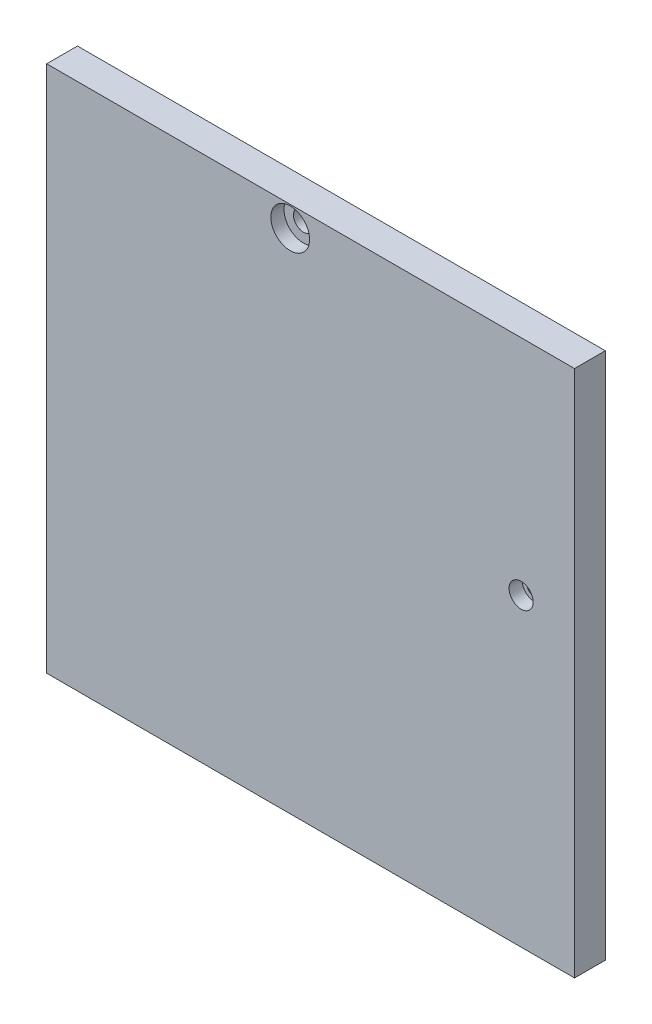
ISO-10303-21;
HEADER;
FILE_DESCRIPTION(('STEP AP214'),'2;1');
FILE_NAME('part.step','',(''),(''),'','','');
FILE_SCHEMA(('AUTOMOTIVE_DESIGN { 1 0 10303 214 1 1 1 1 }'));
ENDSEC;
DATA;
#1=APPLICATION_CONTEXT('core data for automotive mechanical design processes');
#2=APPLICATION_PROTOCOL_DEFINITION('international standard','automotive_design',2000,#1);
#3=PRODUCT_CONTEXT('',#1,'mechanical');
#4=PRODUCT('Part','Part','',(#3));
#5=PRODUCT_RELATED_PRODUCT_CATEGORY('part','',(#4));
#6=PRODUCT_DEFINITION_FORMATION('','',#4);
#7=PRODUCT_DEFINITION_CONTEXT('part definition',#1,'design');
#8=PRODUCT_DEFINITION('design','',#6,#7);
#9=PRODUCT_DEFINITION_SHAPE('','',#8);
#10=(LENGTH_UNIT() NAMED_UNIT(*) SI_UNIT(.MILLI.,.METRE.));
#11=(NAMED_UNIT(*) PLANE_ANGLE_UNIT() SI_UNIT($,.RADIAN.));
#12=(NAMED_UNIT(*) SI_UNIT($,.STERADIAN.) SOLID_ANGLE_UNIT());
#13=UNCERTAINTY_MEASURE_WITH_UNIT(LENGTH_MEASURE(1.E-05),#10,'distance_accuracy_value','');
#14=(GEOMETRIC_REPRESENTATION_CONTEXT(3) GLOBAL_UNCERTAINTY_ASSIGNED_CONTEXT((#13)) GLOBAL_UNIT_ASSIGNED_CONTEXT((#10,
#11,#12)) REPRESENTATION_CONTEXT('',''));
#15=CARTESIAN_POINT('',(0.,0.,0.));
#16=DIRECTION('',(0.,0.,1.));
#17=DIRECTION('',(1.,0.,0.));
#18=AXIS2_PLACEMENT_3D('',#15,#16,#17);
#19=CARTESIAN_POINT('',(52.5,26.7103135608783,0.));
#20=DIRECTION('',(0.,0.,1.));
#21=DIRECTION('',(1.,0.,0.));
#22=AXIS2_PLACEMENT_3D('',#19,#20,#21);
#23=CYLINDRICAL_SURFACE('',#22,1.75584469679078);
#24=CARTESIAN_POINT('',(52.5,26.7103135608783,0.));
#25=DIRECTION('',(0.,0.,1.));
#26=DIRECTION('',(1.,0.,0.));
#27=AXIS2_PLACEMENT_3D('',#24,#25,#26);
#28=CIRCLE('',#27,1.75584469679078);
#29=CARTESIAN_POINT('',(54.2558446967908,26.7103135608783,0.));
#30=VERTEX_POINT('',#29);
#31=EDGE_CURVE('E127',#30,#30,#28,.T.);
#32=ORIENTED_EDGE('',*,*,#31,.F.);
#33=EDGE_LOOP('',(#32));
#34=FACE_BOUND('',#33,.T.);
#35=CARTESIAN_POINT('',(52.5,26.7103135608783,4.));
#36=DIRECTION('',(0.,0.,1.));
#37=DIRECTION('',(1.,0.,0.));
#38=AXIS2_PLACEMENT_3D('',#35,#36,#37);
#39=CIRCLE('',#38,1.75584469679078);
#40=CARTESIAN_POINT('',(54.2558446967908,26.7103135608783,4.));
#41=VERTEX_POINT('',#40);
#42=EDGE_CURVE('E43',#41,#41,#39,.F.);
#43=ORIENTED_EDGE('',*,*,#42,.F.);
#44=EDGE_LOOP('',(#43));
#45=FACE_BOUND('',#44,.T.);
#46=ADVANCED_FACE('F39',(#34,#45),#23,.F.);
#47=CARTESIAN_POINT('',(0.,72.7103135608783,0.));
#48=DIRECTION('',(0.,0.,1.));
#49=DIRECTION('',(1.,0.,0.));
#50=AXIS2_PLACEMENT_3D('',#47,#48,#49);
#51=CYLINDRICAL_SURFACE('',#50,2.26170960327257);
#52=CARTESIAN_POINT('',(0.,72.7103135608783,0.));
#53=DIRECTION('',(0.,0.,1.));
#54=DIRECTION('',(1.,0.,0.));
#55=AXIS2_PLACEMENT_3D('',#52,#53,#54);
#56=CIRCLE('',#55,2.26170960327257);
#57=CARTESIAN_POINT('',(2.26170960327257,72.7103135608783,0.));
#58=VERTEX_POINT('',#57);
#59=EDGE_CURVE('E109',#58,#58,#56,.T.);
#60=ORIENTED_EDGE('',*,*,#59,.F.);
#61=EDGE_LOOP('',(#60));
#62=FACE_BOUND('',#61,.T.);
#63=CARTESIAN_POINT('',(0.,72.7103135608783,4.));
#64=DIRECTION('',(0.,0.,1.));
#65=DIRECTION('',(1.,0.,0.));
#66=AXIS2_PLACEMENT_3D('',#63,#64,#65);
#67=CIRCLE('',#66,2.26170960327257);
#68=CARTESIAN_POINT('',(2.26170960327257,72.7103135608783,4.));
#69=VERTEX_POINT('',#68);
#70=EDGE_CURVE('E114',#69,#69,#67,.F.);
#71=ORIENTED_EDGE('',*,*,#70,.F.);
#72=EDGE_LOOP('',(#71));
#73=FACE_BOUND('',#72,.T.);
#74=ADVANCED_FACE('F145',(#62,#73),#51,.F.);
#75=CARTESIAN_POINT('',(-55.3615679526822,77.4232224220167,7.));
#76=DIRECTION('',(1.,0.,0.));
#77=DIRECTION('',(0.,1.,0.));
#78=AXIS2_PLACEMENT_3D('',#75,#76,#77);
#79=PLANE('',#78);
#80=DIRECTION('',(0.,-1.,0.));
#81=VECTOR('',#80,1.);
#82=CARTESIAN_POINT('',(-55.3615679526822,77.4232224220167,0.));
#83=LINE('',#82,#81);
#84=CARTESIAN_POINT('',(-55.3615679526822,77.4232224220167,0.));
#85=VERTEX_POINT('',#84);
#86=CARTESIAN_POINT('',(-55.3615679526822,-42.5767775779833,0.));
#87=VERTEX_POINT('',#86);
#88=EDGE_CURVE('E106',#85,#87,#83,.T.);
#89=ORIENTED_EDGE('',*,*,#88,.T.);
#90=DIRECTION('',(0.,0.,-1.));
#91=VECTOR('',#90,1.);
#92=CARTESIAN_POINT('',(-55.3615679526822,-42.5767775779833,7.));
#93=LINE('',#92,#91);
#94=CARTESIAN_POINT('',(-55.3615679526822,-42.5767775779833,7.));
#95=VERTEX_POINT('',#94);
#96=EDGE_CURVE('E11',#95,#87,#93,.T.);
#97=ORIENTED_EDGE('',*,*,#96,.F.);
#98=DIRECTION('',(0.,-1.,0.));
#99=VECTOR('',#98,1.);
#100=CARTESIAN_POINT('',(-55.3615679526822,77.4232224220167,7.));
#101=LINE('',#100,#99);
#102=CARTESIAN_POINT('',(-55.3615679526822,77.4232224220167,7.));
#103=VERTEX_POINT('',#102);
#104=EDGE_CURVE('E93',#103,#95,#101,.T.);
#105=ORIENTED_EDGE('',*,*,#104,.F.);
#106=DIRECTION('',(0.,0.,-1.));
#107=VECTOR('',#106,1.);
#108=CARTESIAN_POINT('',(-55.3615679526822,77.4232224220167,7.));
#109=LINE('',#108,#107);
#110=EDGE_CURVE('E102',#103,#85,#109,.T.);
#111=ORIENTED_EDGE('',*,*,#110,.T.);
#112=EDGE_LOOP('',(#89,#97,#105,#111));
#113=FACE_BOUND('',#112,.T.);
#114=ADVANCED_FACE('F41',(#113),#79,.F.);
#115=CARTESIAN_POINT('',(-55.3615679526822,-42.5767775779833,7.));
#116=DIRECTION('',(0.,1.,0.));
#117=DIRECTION('',(0.,0.,1.));
#118=AXIS2_PLACEMENT_3D('',#115,#116,#117);
#119=PLANE('',#118);
#120=DIRECTION('',(1.,0.,0.));
#121=VECTOR('',#120,1.);
#122=CARTESIAN_POINT('',(-55.3615679526822,-42.5767775779833,0.));
#123=LINE('',#122,#121);
#124=CARTESIAN_POINT('',(64.6384320473178,-42.5767775779833,0.));
#125=VERTEX_POINT('',#124);
#126=EDGE_CURVE('E97',#87,#125,#123,.T.);
#127=ORIENTED_EDGE('',*,*,#126,.T.);
#128=DIRECTION('',(0.,0.,-1.));
#129=VECTOR('',#128,1.);
#130=CARTESIAN_POINT('',(64.6384320473178,-42.5767775779833,7.));
#131=LINE('',#130,#129);
#132=CARTESIAN_POINT('',(64.6384320473178,-42.5767775779833,7.));
#133=VERTEX_POINT('',#132);
#134=EDGE_CURVE('E49',#133,#125,#131,.T.);
#135=ORIENTED_EDGE('',*,*,#134,.F.);
#136=DIRECTION('',(1.,0.,0.));
#137=VECTOR('',#136,1.);
#138=CARTESIAN_POINT('',(-55.3615679526822,-42.5767775779833,7.));
#139=LINE('',#138,#137);
#140=EDGE_CURVE('E88',#95,#133,#139,.T.);
#141=ORIENTED_EDGE('',*,*,#140,.F.);
#142=ORIENTED_EDGE('',*,*,#96,.T.);
#143=EDGE_LOOP('',(#127,#135,#141,#142));
#144=FACE_BOUND('',#143,.T.);
#145=ADVANCED_FACE('F96',(#144),#119,.F.);
#146=CARTESIAN_POINT('',(64.6384320473178,77.4232224220167,7.));
#147=DIRECTION('',(-1.,0.,0.));
#148=DIRECTION('',(0.,-1.,0.));
#149=AXIS2_PLACEMENT_3D('',#146,#147,#148);
#150=PLANE('',#149);
#151=DIRECTION('',(0.,1.,0.));
#152=VECTOR('',#151,1.);
#153=CARTESIAN_POINT('',(64.6384320473178,77.4232224220167,0.));
#154=LINE('',#153,#152);
#155=CARTESIAN_POINT('',(64.6384320473178,77.4232224220167,0.));
#156=VERTEX_POINT('',#155);
#157=EDGE_CURVE('E75',#125,#156,#154,.T.);
#158=ORIENTED_EDGE('',*,*,#157,.T.);
#159=DIRECTION('',(0.,0.,-1.));
#160=VECTOR('',#159,1.);
#161=CARTESIAN_POINT('',(64.6384320473178,77.4232224220167,7.));
#162=LINE('',#161,#160);
#163=CARTESIAN_POINT('',(64.6384320473178,77.4232224220167,7.));
#164=VERTEX_POINT('',#163);
#165=EDGE_CURVE('E98',#164,#156,#162,.T.);
#166=ORIENTED_EDGE('',*,*,#165,.F.);
#167=DIRECTION('',(0.,1.,0.));
#168=VECTOR('',#167,1.);
#169=CARTESIAN_POINT('',(64.6384320473178,77.4232224220167,7.));
#170=LINE('',#169,#168);
#171=EDGE_CURVE('E91',#133,#164,#170,.T.);
#172=ORIENTED_EDGE('',*,*,#171,.F.);
#173=ORIENTED_EDGE('',*,*,#134,.T.);
#174=EDGE_LOOP('',(#158,#166,#172,#173));
#175=FACE_BOUND('',#174,.T.);
#176=ADVANCED_FACE('F100',(#175),#150,.F.);
#177=CARTESIAN_POINT('',(-55.3615679526822,77.4232224220167,7.));
#178=DIRECTION('',(0.,-1.,0.));
#179=DIRECTION('',(0.,0.,-1.));
#180=AXIS2_PLACEMENT_3D('',#177,#178,#179);
#181=PLANE('',#180);
#182=DIRECTION('',(-1.,0.,0.));
#183=VECTOR('',#182,1.);
#184=CARTESIAN_POINT('',(-55.3615679526822,77.4232224220167,0.));
#185=LINE('',#184,#183);
#186=EDGE_CURVE('E81',#156,#85,#185,.T.);
#187=ORIENTED_EDGE('',*,*,#186,.T.);
#188=ORIENTED_EDGE('',*,*,#110,.F.);
#189=DIRECTION('',(-1.,0.,0.));
#190=VECTOR('',#189,1.);
#191=CARTESIAN_POINT('',(-55.3615679526822,77.4232224220167,7.));
#192=LINE('',#191,#190);
#193=EDGE_CURVE('E58',#164,#103,#192,.T.);
#194=ORIENTED_EDGE('',*,*,#193,.F.);
#195=ORIENTED_EDGE('',*,*,#165,.T.);
#196=EDGE_LOOP('',(#187,#188,#194,#195));
#197=FACE_BOUND('',#196,.T.);
#198=ADVANCED_FACE('F169',(#197),#181,.F.);
#199=CARTESIAN_POINT('',(0.,0.,7.));
#200=DIRECTION('',(0.,0.,1.));
#201=DIRECTION('',(1.,0.,0.));
#202=AXIS2_PLACEMENT_3D('',#199,#200,#201);
#203=PLANE('',#202);
#204=CARTESIAN_POINT('',(52.5,26.7103135608783,7.));
#205=DIRECTION('',(0.,0.,1.));
#206=DIRECTION('',(1.,0.,0.));
#207=AXIS2_PLACEMENT_3D('',#204,#205,#206);
#208=CIRCLE('',#207,2.74490759199065);
#209=CARTESIAN_POINT('',(55.2449075919907,26.7103135608783,7.));
#210=VERTEX_POINT('',#209);
#211=EDGE_CURVE('E132',#210,#210,#208,.T.);
#212=ORIENTED_EDGE('',*,*,#211,.F.);
#213=EDGE_LOOP('',(#212));
#214=FACE_BOUND('',#213,.T.);
#215=CARTESIAN_POINT('',(0.,72.7103135608783,7.));
#216=DIRECTION('',(0.,0.,1.));
#217=DIRECTION('',(1.,0.,0.));
#218=AXIS2_PLACEMENT_3D('',#215,#216,#217);
#219=CIRCLE('',#218,4.40688020607494);
#220=CARTESIAN_POINT('',(4.40688020607494,72.7103135608783,7.));
#221=VERTEX_POINT('',#220);
#222=EDGE_CURVE('E122',#221,#221,#219,.T.);
#223=ORIENTED_EDGE('',*,*,#222,.F.);
#224=EDGE_LOOP('',(#223));
#225=FACE_BOUND('',#224,.T.);
#226=ORIENTED_EDGE('',*,*,#104,.T.);
#227=ORIENTED_EDGE('',*,*,#140,.T.);
#228=ORIENTED_EDGE('',*,*,#171,.T.);
#229=ORIENTED_EDGE('',*,*,#193,.T.);
#230=EDGE_LOOP('',(#226,#227,#228,#229));
#231=FACE_BOUND('',#230,.T.);
#232=ADVANCED_FACE('F89',(#214,#225,#231),#203,.T.);
#233=CARTESIAN_POINT('',(0.,0.,0.));
#234=DIRECTION('',(0.,0.,1.));
#235=DIRECTION('',(1.,0.,0.));
#236=AXIS2_PLACEMENT_3D('',#233,#234,#235);
#237=PLANE('',#236);
#238=ORIENTED_EDGE('',*,*,#31,.T.);
#239=EDGE_LOOP('',(#238));
#240=FACE_BOUND('',#239,.T.);
#241=ORIENTED_EDGE('',*,*,#59,.T.);
#242=EDGE_LOOP('',(#241));
#243=FACE_BOUND('',#242,.T.);
#244=ORIENTED_EDGE('',*,*,#88,.F.);
#245=ORIENTED_EDGE('',*,*,#186,.F.);
#246=ORIENTED_EDGE('',*,*,#157,.F.);
#247=ORIENTED_EDGE('',*,*,#126,.F.);
#248=EDGE_LOOP('',(#244,#245,#246,#247));
#249=FACE_BOUND('',#248,.T.);
#250=ADVANCED_FACE('F164',(#240,#243,#249),#237,.F.);
#251=CARTESIAN_POINT('',(0.,72.7103135608783,4.));
#252=DIRECTION('',(0.,0.,1.));
#253=DIRECTION('',(1.,0.,0.));
#254=AXIS2_PLACEMENT_3D('',#251,#252,#253);
#255=PLANE('',#254);
#256=CARTESIAN_POINT('',(0.,72.7103135608783,4.));
#257=DIRECTION('',(0.,0.,1.));
#258=DIRECTION('',(1.,0.,0.));
#259=AXIS2_PLACEMENT_3D('',#256,#257,#258);
#260=CIRCLE('',#259,4.40688020607494);
#261=CARTESIAN_POINT('',(4.40688020607494,72.7103135608783,4.));
#262=VERTEX_POINT('',#261);
#263=EDGE_CURVE('E116',#262,#262,#260,.T.);
#264=ORIENTED_EDGE('',*,*,#263,.T.);
#265=EDGE_LOOP('',(#264));
#266=FACE_BOUND('',#265,.T.);
#267=ORIENTED_EDGE('',*,*,#70,.T.);
#268=EDGE_LOOP('',(#267));
#269=FACE_BOUND('',#268,.T.);
#270=ADVANCED_FACE('F160',(#266,#269),#255,.T.);
#271=CARTESIAN_POINT('',(0.,72.7103135608783,4.));
#272=DIRECTION('',(0.,0.,1.));
#273=DIRECTION('',(1.,0.,0.));
#274=AXIS2_PLACEMENT_3D('',#271,#272,#273);
#275=CYLINDRICAL_SURFACE('',#274,4.40688020607494);
#276=ORIENTED_EDGE('',*,*,#263,.F.);
#277=EDGE_LOOP('',(#276));
#278=FACE_BOUND('',#277,.T.);
#279=ORIENTED_EDGE('',*,*,#222,.T.);
#280=EDGE_LOOP('',(#279));
#281=FACE_BOUND('',#280,.T.);
#282=ADVANCED_FACE('F163',(#278,#281),#275,.F.);
#283=CARTESIAN_POINT('',(52.5,26.7103135608783,4.));
#284=DIRECTION('',(0.,0.,1.));
#285=DIRECTION('',(1.,0.,0.));
#286=AXIS2_PLACEMENT_3D('',#283,#284,#285);
#287=PLANE('',#286);
#288=CARTESIAN_POINT('',(52.5,26.7103135608783,4.));
#289=DIRECTION('',(0.,0.,1.));
#290=DIRECTION('',(1.,0.,0.));
#291=AXIS2_PLACEMENT_3D('',#288,#289,#290);
#292=CIRCLE('',#291,2.74490759199065);
#293=CARTESIAN_POINT('',(55.2449075919907,26.7103135608783,4.));
#294=VERTEX_POINT('',#293);
#295=EDGE_CURVE('E135',#294,#294,#292,.T.);
#296=ORIENTED_EDGE('',*,*,#295,.T.);
#297=EDGE_LOOP('',(#296));
#298=FACE_BOUND('',#297,.T.);
#299=ORIENTED_EDGE('',*,*,#42,.T.);
#300=EDGE_LOOP('',(#299));
#301=FACE_BOUND('',#300,.T.);
#302=ADVANCED_FACE('F142',(#298,#301),#287,.T.);
#303=CARTESIAN_POINT('',(52.5,26.7103135608783,4.));
#304=DIRECTION('',(0.,0.,1.));
#305=DIRECTION('',(1.,0.,0.));
#306=AXIS2_PLACEMENT_3D('',#303,#304,#305);
#307=CYLINDRICAL_SURFACE('',#306,2.74490759199065);
#308=ORIENTED_EDGE('',*,*,#295,.F.);
#309=EDGE_LOOP('',(#308));
#310=FACE_BOUND('',#309,.T.);
#311=ORIENTED_EDGE('',*,*,#211,.T.);
#312=EDGE_LOOP('',(#311));
#313=FACE_BOUND('',#312,.T.);
#314=ADVANCED_FACE('F158',(#310,#313),#307,.F.);
#315=CLOSED_SHELL('',(#46,#74,#114,#145,#176,#198,#232,#250,#270,#282,#302,#314));
#316=MANIFOLD_SOLID_BREP('B2',#315);
#317=ADVANCED_BREP_SHAPE_REPRESENTATION('',(#18,#316),#14);
#318=SHAPE_DEFINITION_REPRESENTATION(#9,#317);
ENDSEC;
END-ISO-10303-21;
